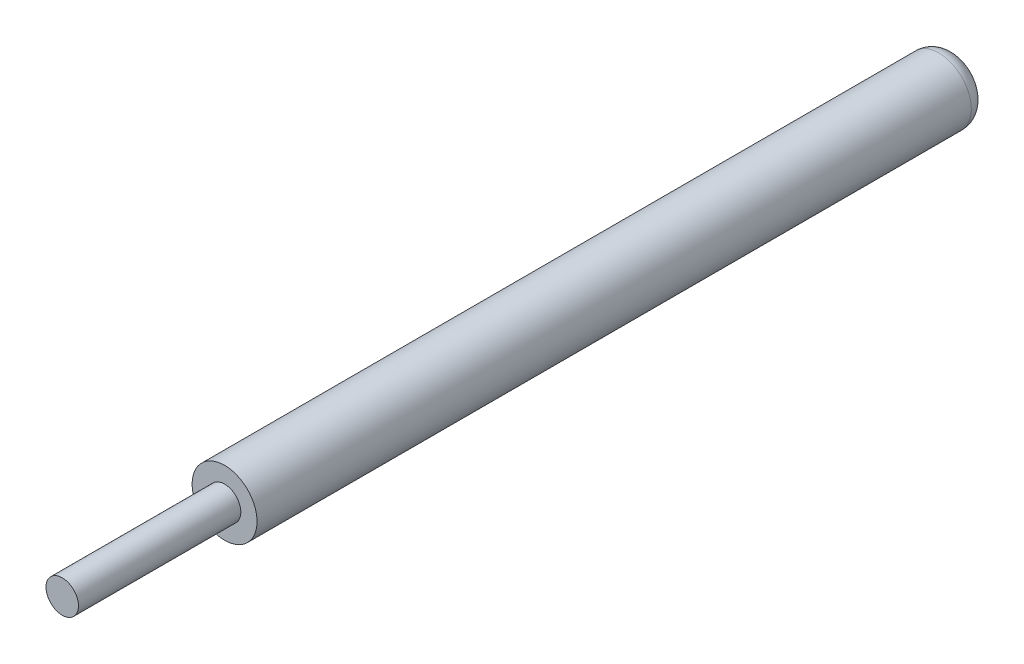
ISO-10303-21;
HEADER;
FILE_DESCRIPTION(('STEP AP214'),'2;1');
FILE_NAME('part.step','',(''),(''),'','','');
FILE_SCHEMA(('AUTOMOTIVE_DESIGN { 1 0 10303 214 1 1 1 1 }'));
ENDSEC;
DATA;
#1=APPLICATION_CONTEXT('core data for automotive mechanical design processes');
#2=APPLICATION_PROTOCOL_DEFINITION('international standard','automotive_design',2000,#1);
#3=PRODUCT_CONTEXT('',#1,'mechanical');
#4=PRODUCT('Part','Part','',(#3));
#5=PRODUCT_RELATED_PRODUCT_CATEGORY('part','',(#4));
#6=PRODUCT_DEFINITION_FORMATION('','',#4);
#7=PRODUCT_DEFINITION_CONTEXT('part definition',#1,'design');
#8=PRODUCT_DEFINITION('design','',#6,#7);
#9=PRODUCT_DEFINITION_SHAPE('','',#8);
#10=(LENGTH_UNIT() NAMED_UNIT(*) SI_UNIT(.MILLI.,.METRE.));
#11=(NAMED_UNIT(*) PLANE_ANGLE_UNIT() SI_UNIT($,.RADIAN.));
#12=(NAMED_UNIT(*) SI_UNIT($,.STERADIAN.) SOLID_ANGLE_UNIT());
#13=UNCERTAINTY_MEASURE_WITH_UNIT(LENGTH_MEASURE(1.E-05),#10,'distance_accuracy_value','');
#14=(GEOMETRIC_REPRESENTATION_CONTEXT(3) GLOBAL_UNCERTAINTY_ASSIGNED_CONTEXT((#13)) GLOBAL_UNIT_ASSIGNED_CONTEXT((#10,
#11,#12)) REPRESENTATION_CONTEXT('',''));
#15=CARTESIAN_POINT('',(0.,0.,0.));
#16=DIRECTION('',(0.,0.,1.));
#17=DIRECTION('',(1.,0.,0.));
#18=AXIS2_PLACEMENT_3D('',#15,#16,#17);
#19=CARTESIAN_POINT('',(0.,0.,-5.715));
#20=DIRECTION('',(0.,0.,-1.));
#21=DIRECTION('',(0.,1.,0.));
#22=AXIS2_PLACEMENT_3D('',#19,#20,#21);
#23=CYLINDRICAL_SURFACE('',#22,0.254);
#24=CARTESIAN_POINT('',(0.,0.,0.));
#25=DIRECTION('',(0.,0.,-1.));
#26=DIRECTION('',(-1.,0.,0.));
#27=AXIS2_PLACEMENT_3D('',#24,#25,#26);
#28=CIRCLE('',#27,0.254);
#29=CARTESIAN_POINT('',(-0.254,0.,0.));
#30=VERTEX_POINT('',#29);
#31=EDGE_CURVE('E47',#30,#30,#28,.F.);
#32=ORIENTED_EDGE('',*,*,#31,.F.);
#33=EDGE_LOOP('',(#32));
#34=FACE_BOUND('',#33,.T.);
#35=CARTESIAN_POINT('',(0.,0.,-5.588));
#36=DIRECTION('',(0.,0.,-1.));
#37=DIRECTION('',(0.,1.,0.));
#38=AXIS2_PLACEMENT_3D('',#35,#36,#37);
#39=CIRCLE('',#38,0.254);
#40=CARTESIAN_POINT('',(0.,0.254,-5.588));
#41=VERTEX_POINT('',#40);
#42=EDGE_CURVE('E10',#41,#41,#39,.F.);
#43=ORIENTED_EDGE('',*,*,#42,.T.);
#44=EDGE_LOOP('',(#43));
#45=FACE_BOUND('',#44,.T.);
#46=ADVANCED_FACE('F32',(#34,#45),#23,.T.);
#47=CARTESIAN_POINT('',(0.,0.254,-5.715));
#48=DIRECTION('',(0.,0.,-1.));
#49=DIRECTION('',(0.,1.,0.));
#50=AXIS2_PLACEMENT_3D('',#47,#48,#49);
#51=PLANE('',#50);
#52=CARTESIAN_POINT('',(0.,0.,-5.715));
#53=DIRECTION('',(0.,0.,-1.));
#54=DIRECTION('',(0.,1.,0.));
#55=AXIS2_PLACEMENT_3D('',#52,#53,#54);
#56=CIRCLE('',#55,0.127);
#57=CARTESIAN_POINT('',(0.,0.127,-5.715));
#58=VERTEX_POINT('',#57);
#59=EDGE_CURVE('E40',#58,#58,#56,.T.);
#60=ORIENTED_EDGE('',*,*,#59,.T.);
#61=EDGE_LOOP('',(#60));
#62=FACE_BOUND('',#61,.T.);
#63=ADVANCED_FACE('F68',(#62),#51,.T.);
#64=CARTESIAN_POINT('',(0.,0.,-5.588));
#65=DIRECTION('',(0.,0.,-1.));
#66=DIRECTION('',(0.,1.,0.));
#67=AXIS2_PLACEMENT_3D('',#64,#65,#66);
#68=DEGENERATE_TOROIDAL_SURFACE('',#67,0.127,0.127,.T.);
#69=ORIENTED_EDGE('',*,*,#42,.F.);
#70=EDGE_LOOP('',(#69));
#71=FACE_BOUND('',#70,.T.);
#72=ORIENTED_EDGE('',*,*,#59,.F.);
#73=EDGE_LOOP('',(#72));
#74=FACE_BOUND('',#73,.T.);
#75=ADVANCED_FACE('F34',(#71,#74),#68,.T.);
#76=CARTESIAN_POINT('',(0.,0.,1.61893462358714));
#77=DIRECTION('',(0.,0.,-1.));
#78=DIRECTION('',(-1.,0.,0.));
#79=AXIS2_PLACEMENT_3D('',#76,#77,#78);
#80=CYLINDRICAL_SURFACE('',#79,0.127);
#81=CARTESIAN_POINT('',(0.,0.,1.27));
#82=DIRECTION('',(0.,0.,1.));
#83=DIRECTION('',(0.,-1.,0.));
#84=AXIS2_PLACEMENT_3D('',#81,#82,#83);
#85=CIRCLE('',#84,0.127);
#86=CARTESIAN_POINT('',(0.,-0.127,1.27));
#87=VERTEX_POINT('',#86);
#88=EDGE_CURVE('E36',#87,#87,#85,.F.);
#89=ORIENTED_EDGE('',*,*,#88,.T.);
#90=EDGE_LOOP('',(#89));
#91=FACE_BOUND('',#90,.T.);
#92=CARTESIAN_POINT('',(0.,0.,0.));
#93=DIRECTION('',(0.,0.,-1.));
#94=DIRECTION('',(-1.,0.,0.));
#95=AXIS2_PLACEMENT_3D('',#92,#93,#94);
#96=CIRCLE('',#95,0.127);
#97=CARTESIAN_POINT('',(-0.127,0.,0.));
#98=VERTEX_POINT('',#97);
#99=EDGE_CURVE('E49',#98,#98,#96,.T.);
#100=ORIENTED_EDGE('',*,*,#99,.F.);
#101=EDGE_LOOP('',(#100));
#102=FACE_BOUND('',#101,.T.);
#103=ADVANCED_FACE('F58',(#91,#102),#80,.T.);
#104=CARTESIAN_POINT('',(0.,0.609923209822384,0.));
#105=DIRECTION('',(0.,0.,-1.));
#106=DIRECTION('',(-1.,0.,0.));
#107=AXIS2_PLACEMENT_3D('',#104,#105,#106);
#108=PLANE('',#107);
#109=ORIENTED_EDGE('',*,*,#31,.T.);
#110=EDGE_LOOP('',(#109));
#111=FACE_BOUND('',#110,.T.);
#112=ORIENTED_EDGE('',*,*,#99,.T.);
#113=EDGE_LOOP('',(#112));
#114=FACE_BOUND('',#113,.T.);
#115=ADVANCED_FACE('F56',(#111,#114),#108,.F.);
#116=CARTESIAN_POINT('',(0.,0.,1.27));
#117=DIRECTION('',(0.,0.,1.));
#118=DIRECTION('',(0.,-1.,0.));
#119=AXIS2_PLACEMENT_3D('',#116,#117,#118);
#120=PLANE('',#119);
#121=ORIENTED_EDGE('',*,*,#88,.F.);
#122=EDGE_LOOP('',(#121));
#123=FACE_BOUND('',#122,.T.);
#124=ADVANCED_FACE('F66',(#123),#120,.T.);
#125=CLOSED_SHELL('',(#46,#63,#75,#103,#115,#124));
#126=MANIFOLD_SOLID_BREP('B2',#125);
#127=ADVANCED_BREP_SHAPE_REPRESENTATION('',(#18,#126),#14);
#128=SHAPE_DEFINITION_REPRESENTATION(#9,#127);
ENDSEC;
END-ISO-10303-21;
